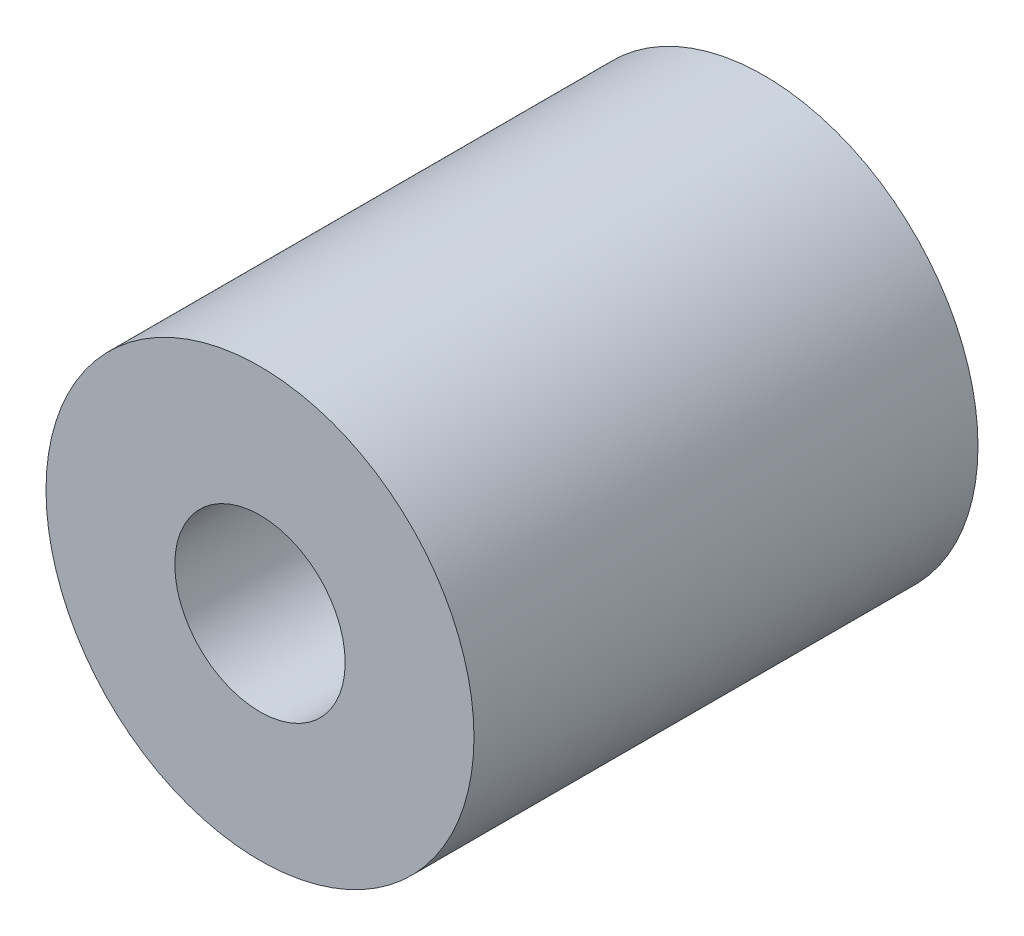
ISO-10303-21;
HEADER;
FILE_DESCRIPTION(('STEP AP214'),'2;1');
FILE_NAME('part.step','',(''),(''),'','','');
FILE_SCHEMA(('AUTOMOTIVE_DESIGN { 1 0 10303 214 1 1 1 1 }'));
ENDSEC;
DATA;
#1=APPLICATION_CONTEXT('core data for automotive mechanical design processes');
#2=APPLICATION_PROTOCOL_DEFINITION('international standard','automotive_design',2000,#1);
#3=PRODUCT_CONTEXT('',#1,'mechanical');
#4=PRODUCT('Part','Part','',(#3));
#5=PRODUCT_RELATED_PRODUCT_CATEGORY('part','',(#4));
#6=PRODUCT_DEFINITION_FORMATION('','',#4);
#7=PRODUCT_DEFINITION_CONTEXT('part definition',#1,'design');
#8=PRODUCT_DEFINITION('design','',#6,#7);
#9=PRODUCT_DEFINITION_SHAPE('','',#8);
#10=(LENGTH_UNIT() NAMED_UNIT(*) SI_UNIT(.MILLI.,.METRE.));
#11=(NAMED_UNIT(*) PLANE_ANGLE_UNIT() SI_UNIT($,.RADIAN.));
#12=(NAMED_UNIT(*) SI_UNIT($,.STERADIAN.) SOLID_ANGLE_UNIT());
#13=UNCERTAINTY_MEASURE_WITH_UNIT(LENGTH_MEASURE(1.E-05),#10,'distance_accuracy_value','');
#14=(GEOMETRIC_REPRESENTATION_CONTEXT(3) GLOBAL_UNCERTAINTY_ASSIGNED_CONTEXT((#13)) GLOBAL_UNIT_ASSIGNED_CONTEXT((#10,
#11,#12)) REPRESENTATION_CONTEXT('',''));
#15=CARTESIAN_POINT('',(0.,0.,0.));
#16=DIRECTION('',(0.,0.,1.));
#17=DIRECTION('',(1.,0.,0.));
#18=AXIS2_PLACEMENT_3D('',#15,#16,#17);
#19=CARTESIAN_POINT('',(0.,0.,11.74));
#20=DIRECTION('',(0.,0.,1.));
#21=DIRECTION('',(1.,0.,0.));
#22=AXIS2_PLACEMENT_3D('',#19,#20,#21);
#23=PLANE('',#22);
#24=CARTESIAN_POINT('',(0.,0.,11.74));
#25=DIRECTION('',(0.,0.,1.));
#26=DIRECTION('',(1.,0.,0.));
#27=AXIS2_PLACEMENT_3D('',#24,#25,#26);
#28=CIRCLE('',#27,4.984375);
#29=CARTESIAN_POINT('',(4.984375,0.,11.74));
#30=VERTEX_POINT('',#29);
#31=EDGE_CURVE('E10',#30,#30,#28,.T.);
#32=ORIENTED_EDGE('',*,*,#31,.T.);
#33=EDGE_LOOP('',(#32));
#34=FACE_BOUND('',#33,.T.);
#35=CARTESIAN_POINT('',(0.,0.,11.74));
#36=DIRECTION('',(0.,0.,1.));
#37=DIRECTION('',(1.,0.,0.));
#38=AXIS2_PLACEMENT_3D('',#35,#36,#37);
#39=CIRCLE('',#38,1.984375);
#40=CARTESIAN_POINT('',(1.984375,0.,11.74));
#41=VERTEX_POINT('',#40);
#42=EDGE_CURVE('E42',#41,#41,#39,.T.);
#43=ORIENTED_EDGE('',*,*,#42,.F.);
#44=EDGE_LOOP('',(#43));
#45=FACE_BOUND('',#44,.T.);
#46=ADVANCED_FACE('F31',(#34,#45),#23,.T.);
#47=CARTESIAN_POINT('',(0.,0.,0.));
#48=DIRECTION('',(0.,0.,1.));
#49=DIRECTION('',(1.,0.,0.));
#50=AXIS2_PLACEMENT_3D('',#47,#48,#49);
#51=PLANE('',#50);
#52=CARTESIAN_POINT('',(0.,0.,0.));
#53=DIRECTION('',(0.,0.,1.));
#54=DIRECTION('',(1.,0.,0.));
#55=AXIS2_PLACEMENT_3D('',#52,#53,#54);
#56=CIRCLE('',#55,4.984375);
#57=CARTESIAN_POINT('',(4.984375,0.,0.));
#58=VERTEX_POINT('',#57);
#59=EDGE_CURVE('E35',#58,#58,#56,.T.);
#60=ORIENTED_EDGE('',*,*,#59,.F.);
#61=EDGE_LOOP('',(#60));
#62=FACE_BOUND('',#61,.T.);
#63=CARTESIAN_POINT('',(0.,0.,0.));
#64=DIRECTION('',(0.,0.,1.));
#65=DIRECTION('',(1.,0.,0.));
#66=AXIS2_PLACEMENT_3D('',#63,#64,#65);
#67=CIRCLE('',#66,1.984375);
#68=CARTESIAN_POINT('',(1.984375,0.,0.));
#69=VERTEX_POINT('',#68);
#70=EDGE_CURVE('E44',#69,#69,#67,.T.);
#71=ORIENTED_EDGE('',*,*,#70,.T.);
#72=EDGE_LOOP('',(#71));
#73=FACE_BOUND('',#72,.T.);
#74=ADVANCED_FACE('F54',(#62,#73),#51,.F.);
#75=CARTESIAN_POINT('',(0.,0.,11.74));
#76=DIRECTION('',(0.,0.,-1.));
#77=DIRECTION('',(-1.,0.,0.));
#78=AXIS2_PLACEMENT_3D('',#75,#76,#77);
#79=CYLINDRICAL_SURFACE('',#78,4.984375);
#80=ORIENTED_EDGE('',*,*,#31,.F.);
#81=EDGE_LOOP('',(#80));
#82=FACE_BOUND('',#81,.T.);
#83=ORIENTED_EDGE('',*,*,#59,.T.);
#84=EDGE_LOOP('',(#83));
#85=FACE_BOUND('',#84,.T.);
#86=ADVANCED_FACE('F33',(#82,#85),#79,.T.);
#87=CARTESIAN_POINT('',(0.,0.,11.74));
#88=DIRECTION('',(0.,0.,-1.));
#89=DIRECTION('',(-1.,0.,0.));
#90=AXIS2_PLACEMENT_3D('',#87,#88,#89);
#91=CYLINDRICAL_SURFACE('',#90,1.984375);
#92=ORIENTED_EDGE('',*,*,#42,.T.);
#93=EDGE_LOOP('',(#92));
#94=FACE_BOUND('',#93,.T.);
#95=ORIENTED_EDGE('',*,*,#70,.F.);
#96=EDGE_LOOP('',(#95));
#97=FACE_BOUND('',#96,.T.);
#98=ADVANCED_FACE('F50',(#94,#97),#91,.F.);
#99=CLOSED_SHELL('',(#46,#74,#86,#98));
#100=MANIFOLD_SOLID_BREP('B2',#99);
#101=ADVANCED_BREP_SHAPE_REPRESENTATION('',(#18,#100),#14);
#102=SHAPE_DEFINITION_REPRESENTATION(#9,#101);
ENDSEC;
END-ISO-10303-21;
